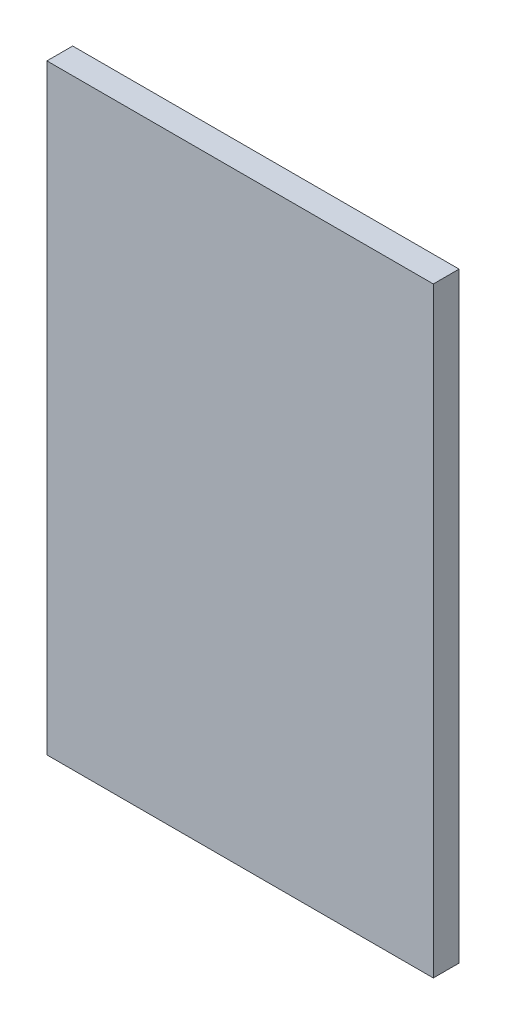
ISO-10303-21;
HEADER;
FILE_DESCRIPTION(('STEP AP214'),'2;1');
FILE_NAME('part.step','',(''),(''),'','','');
FILE_SCHEMA(('AUTOMOTIVE_DESIGN { 1 0 10303 214 1 1 1 1 }'));
ENDSEC;
DATA;
#1=APPLICATION_CONTEXT('core data for automotive mechanical design processes');
#2=APPLICATION_PROTOCOL_DEFINITION('international standard','automotive_design',2000,#1);
#3=PRODUCT_CONTEXT('',#1,'mechanical');
#4=PRODUCT('Part','Part','',(#3));
#5=PRODUCT_RELATED_PRODUCT_CATEGORY('part','',(#4));
#6=PRODUCT_DEFINITION_FORMATION('','',#4);
#7=PRODUCT_DEFINITION_CONTEXT('part definition',#1,'design');
#8=PRODUCT_DEFINITION('design','',#6,#7);
#9=PRODUCT_DEFINITION_SHAPE('','',#8);
#10=(LENGTH_UNIT() NAMED_UNIT(*) SI_UNIT(.MILLI.,.METRE.));
#11=(NAMED_UNIT(*) PLANE_ANGLE_UNIT() SI_UNIT($,.RADIAN.));
#12=(NAMED_UNIT(*) SI_UNIT($,.STERADIAN.) SOLID_ANGLE_UNIT());
#13=UNCERTAINTY_MEASURE_WITH_UNIT(LENGTH_MEASURE(1.E-05),#10,'distance_accuracy_value','');
#14=(GEOMETRIC_REPRESENTATION_CONTEXT(3) GLOBAL_UNCERTAINTY_ASSIGNED_CONTEXT((#13)) GLOBAL_UNIT_ASSIGNED_CONTEXT((#10,
#11,#12)) REPRESENTATION_CONTEXT('',''));
#15=CARTESIAN_POINT('',(0.,0.,0.));
#16=DIRECTION('',(0.,0.,1.));
#17=DIRECTION('',(1.,0.,0.));
#18=AXIS2_PLACEMENT_3D('',#15,#16,#17);
#19=CARTESIAN_POINT('',(-22.5,-35.,3.));
#20=DIRECTION('',(1.,0.,0.));
#21=DIRECTION('',(0.,0.,-1.));
#22=AXIS2_PLACEMENT_3D('',#19,#20,#21);
#23=PLANE('',#22);
#24=DIRECTION('',(0.,-1.,0.));
#25=VECTOR('',#24,1.);
#26=CARTESIAN_POINT('',(-22.5,-35.,0.));
#27=LINE('',#26,#25);
#28=CARTESIAN_POINT('',(-22.5,35.,0.));
#29=VERTEX_POINT('',#28);
#30=CARTESIAN_POINT('',(-22.5,-35.,0.));
#31=VERTEX_POINT('',#30);
#32=EDGE_CURVE('E102',#29,#31,#27,.T.);
#33=ORIENTED_EDGE('',*,*,#32,.T.);
#34=DIRECTION('',(0.,0.,-1.));
#35=VECTOR('',#34,1.);
#36=CARTESIAN_POINT('',(-22.5,-35.,3.));
#37=LINE('',#36,#35);
#38=CARTESIAN_POINT('',(-22.5,-35.,3.));
#39=VERTEX_POINT('',#38);
#40=EDGE_CURVE('E11',#39,#31,#37,.T.);
#41=ORIENTED_EDGE('',*,*,#40,.F.);
#42=DIRECTION('',(0.,-1.,0.));
#43=VECTOR('',#42,1.);
#44=CARTESIAN_POINT('',(-22.5,-35.,3.));
#45=LINE('',#44,#43);
#46=CARTESIAN_POINT('',(-22.5,35.,3.));
#47=VERTEX_POINT('',#46);
#48=EDGE_CURVE('E90',#47,#39,#45,.T.);
#49=ORIENTED_EDGE('',*,*,#48,.F.);
#50=DIRECTION('',(0.,0.,-1.));
#51=VECTOR('',#50,1.);
#52=CARTESIAN_POINT('',(-22.5,35.,3.));
#53=LINE('',#52,#51);
#54=EDGE_CURVE('E98',#47,#29,#53,.T.);
#55=ORIENTED_EDGE('',*,*,#54,.T.);
#56=EDGE_LOOP('',(#33,#41,#49,#55));
#57=FACE_BOUND('',#56,.T.);
#58=ADVANCED_FACE('F39',(#57),#23,.F.);
#59=CARTESIAN_POINT('',(22.5,-35.,3.));
#60=DIRECTION('',(0.,1.,0.));
#61=DIRECTION('',(-1.,0.,0.));
#62=AXIS2_PLACEMENT_3D('',#59,#60,#61);
#63=PLANE('',#62);
#64=DIRECTION('',(1.,0.,0.));
#65=VECTOR('',#64,1.);
#66=CARTESIAN_POINT('',(22.5,-35.,0.));
#67=LINE('',#66,#65);
#68=CARTESIAN_POINT('',(22.5,-35.,0.));
#69=VERTEX_POINT('',#68);
#70=EDGE_CURVE('E94',#31,#69,#67,.T.);
#71=ORIENTED_EDGE('',*,*,#70,.T.);
#72=DIRECTION('',(0.,0.,-1.));
#73=VECTOR('',#72,1.);
#74=CARTESIAN_POINT('',(22.5,-35.,3.));
#75=LINE('',#74,#73);
#76=CARTESIAN_POINT('',(22.5,-35.,3.));
#77=VERTEX_POINT('',#76);
#78=EDGE_CURVE('E47',#77,#69,#75,.T.);
#79=ORIENTED_EDGE('',*,*,#78,.F.);
#80=DIRECTION('',(1.,0.,0.));
#81=VECTOR('',#80,1.);
#82=CARTESIAN_POINT('',(22.5,-35.,3.));
#83=LINE('',#82,#81);
#84=EDGE_CURVE('E85',#39,#77,#83,.T.);
#85=ORIENTED_EDGE('',*,*,#84,.F.);
#86=ORIENTED_EDGE('',*,*,#40,.T.);
#87=EDGE_LOOP('',(#71,#79,#85,#86));
#88=FACE_BOUND('',#87,.T.);
#89=ADVANCED_FACE('F93',(#88),#63,.F.);
#90=CARTESIAN_POINT('',(22.5,-35.,3.));
#91=DIRECTION('',(-1.,0.,0.));
#92=DIRECTION('',(0.,0.,1.));
#93=AXIS2_PLACEMENT_3D('',#90,#91,#92);
#94=PLANE('',#93);
#95=DIRECTION('',(0.,1.,0.));
#96=VECTOR('',#95,1.);
#97=CARTESIAN_POINT('',(22.5,-35.,0.));
#98=LINE('',#97,#96);
#99=CARTESIAN_POINT('',(22.5,35.,0.));
#100=VERTEX_POINT('',#99);
#101=EDGE_CURVE('E72',#69,#100,#98,.T.);
#102=ORIENTED_EDGE('',*,*,#101,.T.);
#103=DIRECTION('',(0.,0.,-1.));
#104=VECTOR('',#103,1.);
#105=CARTESIAN_POINT('',(22.5,35.,3.));
#106=LINE('',#105,#104);
#107=CARTESIAN_POINT('',(22.5,35.,3.));
#108=VERTEX_POINT('',#107);
#109=EDGE_CURVE('E95',#108,#100,#106,.T.);
#110=ORIENTED_EDGE('',*,*,#109,.F.);
#111=DIRECTION('',(0.,1.,0.));
#112=VECTOR('',#111,1.);
#113=CARTESIAN_POINT('',(22.5,-35.,3.));
#114=LINE('',#113,#112);
#115=EDGE_CURVE('E88',#77,#108,#114,.T.);
#116=ORIENTED_EDGE('',*,*,#115,.F.);
#117=ORIENTED_EDGE('',*,*,#78,.T.);
#118=EDGE_LOOP('',(#102,#110,#116,#117));
#119=FACE_BOUND('',#118,.T.);
#120=ADVANCED_FACE('F96',(#119),#94,.F.);
#121=CARTESIAN_POINT('',(22.5,35.,3.));
#122=DIRECTION('',(0.,-1.,0.));
#123=DIRECTION('',(1.,0.,0.));
#124=AXIS2_PLACEMENT_3D('',#121,#122,#123);
#125=PLANE('',#124);
#126=DIRECTION('',(-1.,0.,0.));
#127=VECTOR('',#126,1.);
#128=CARTESIAN_POINT('',(22.5,35.,0.));
#129=LINE('',#128,#127);
#130=EDGE_CURVE('E78',#100,#29,#129,.T.);
#131=ORIENTED_EDGE('',*,*,#130,.T.);
#132=ORIENTED_EDGE('',*,*,#54,.F.);
#133=DIRECTION('',(-1.,0.,0.));
#134=VECTOR('',#133,1.);
#135=CARTESIAN_POINT('',(22.5,35.,3.));
#136=LINE('',#135,#134);
#137=EDGE_CURVE('E55',#108,#47,#136,.T.);
#138=ORIENTED_EDGE('',*,*,#137,.F.);
#139=ORIENTED_EDGE('',*,*,#109,.T.);
#140=EDGE_LOOP('',(#131,#132,#138,#139));
#141=FACE_BOUND('',#140,.T.);
#142=ADVANCED_FACE('F109',(#141),#125,.F.);
#143=CARTESIAN_POINT('',(0.,0.,3.));
#144=DIRECTION('',(0.,0.,1.));
#145=DIRECTION('',(1.,0.,0.));
#146=AXIS2_PLACEMENT_3D('',#143,#144,#145);
#147=PLANE('',#146);
#148=ORIENTED_EDGE('',*,*,#48,.T.);
#149=ORIENTED_EDGE('',*,*,#84,.T.);
#150=ORIENTED_EDGE('',*,*,#115,.T.);
#151=ORIENTED_EDGE('',*,*,#137,.T.);
#152=EDGE_LOOP('',(#148,#149,#150,#151));
#153=FACE_BOUND('',#152,.T.);
#154=ADVANCED_FACE('F86',(#153),#147,.T.);
#155=CARTESIAN_POINT('',(0.,0.,0.));
#156=DIRECTION('',(0.,0.,1.));
#157=DIRECTION('',(1.,0.,0.));
#158=AXIS2_PLACEMENT_3D('',#155,#156,#157);
#159=PLANE('',#158);
#160=ORIENTED_EDGE('',*,*,#32,.F.);
#161=ORIENTED_EDGE('',*,*,#130,.F.);
#162=ORIENTED_EDGE('',*,*,#101,.F.);
#163=ORIENTED_EDGE('',*,*,#70,.F.);
#164=EDGE_LOOP('',(#160,#161,#162,#163));
#165=FACE_BOUND('',#164,.T.);
#166=ADVANCED_FACE('F112',(#165),#159,.F.);
#167=CLOSED_SHELL('',(#58,#89,#120,#142,#154,#166));
#168=MANIFOLD_SOLID_BREP('B2',#167);
#169=ADVANCED_BREP_SHAPE_REPRESENTATION('',(#18,#168),#14);
#170=SHAPE_DEFINITION_REPRESENTATION(#9,#169);
ENDSEC;
END-ISO-10303-21;
